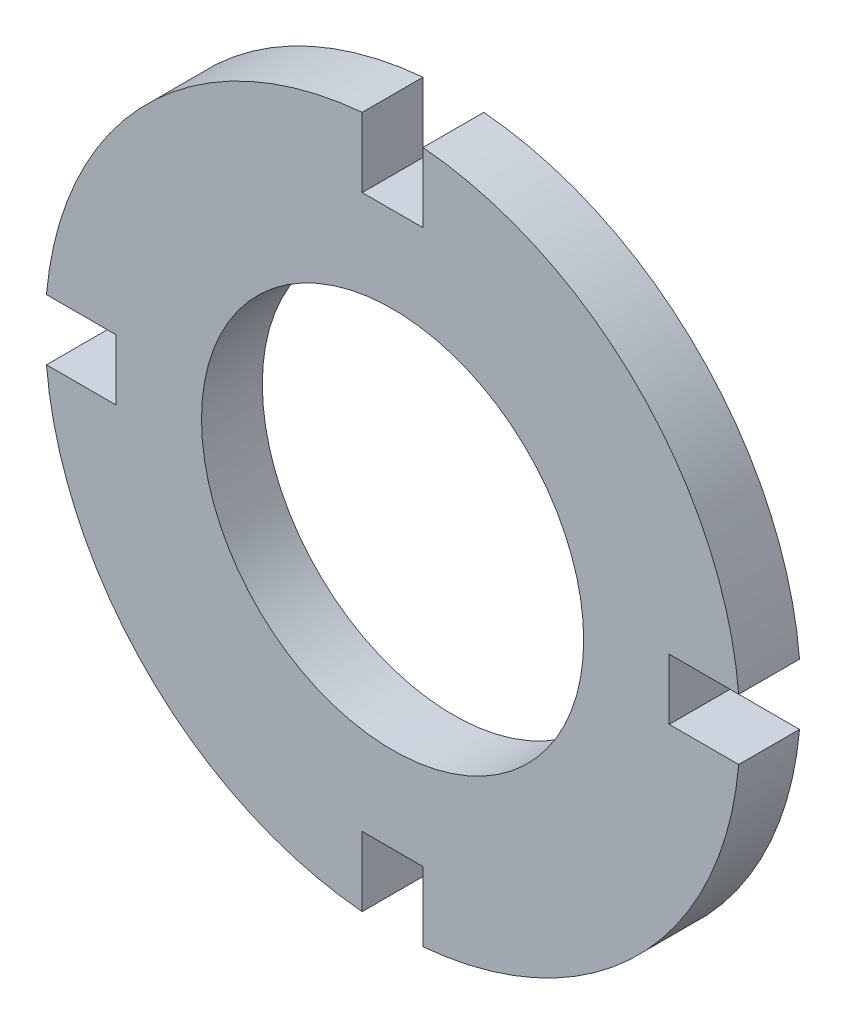
ISO-10303-21;
HEADER;
FILE_DESCRIPTION(('STEP AP214'),'2;1');
FILE_NAME('part.step','',(''),(''),'','','');
FILE_SCHEMA(('AUTOMOTIVE_DESIGN { 1 0 10303 214 1 1 1 1 }'));
ENDSEC;
DATA;
#1=APPLICATION_CONTEXT('core data for automotive mechanical design processes');
#2=APPLICATION_PROTOCOL_DEFINITION('international standard','automotive_design',2000,#1);
#3=PRODUCT_CONTEXT('',#1,'mechanical');
#4=PRODUCT('Part','Part','',(#3));
#5=PRODUCT_RELATED_PRODUCT_CATEGORY('part','',(#4));
#6=PRODUCT_DEFINITION_FORMATION('','',#4);
#7=PRODUCT_DEFINITION_CONTEXT('part definition',#1,'design');
#8=PRODUCT_DEFINITION('design','',#6,#7);
#9=PRODUCT_DEFINITION_SHAPE('','',#8);
#10=(LENGTH_UNIT() NAMED_UNIT(*) SI_UNIT(.MILLI.,.METRE.));
#11=(NAMED_UNIT(*) PLANE_ANGLE_UNIT() SI_UNIT($,.RADIAN.));
#12=(NAMED_UNIT(*) SI_UNIT($,.STERADIAN.) SOLID_ANGLE_UNIT());
#13=UNCERTAINTY_MEASURE_WITH_UNIT(LENGTH_MEASURE(1.E-05),#10,'distance_accuracy_value','');
#14=(GEOMETRIC_REPRESENTATION_CONTEXT(3) GLOBAL_UNCERTAINTY_ASSIGNED_CONTEXT((#13)) GLOBAL_UNIT_ASSIGNED_CONTEXT((#10,
#11,#12)) REPRESENTATION_CONTEXT('',''));
#15=CARTESIAN_POINT('',(0.,0.,0.));
#16=DIRECTION('',(0.,0.,1.));
#17=DIRECTION('',(1.,0.,0.));
#18=AXIS2_PLACEMENT_3D('',#15,#16,#17);
#19=CARTESIAN_POINT('',(0.,0.,4.445));
#20=DIRECTION('',(0.,0.,1.));
#21=DIRECTION('',(1.,0.,0.));
#22=AXIS2_PLACEMENT_3D('',#19,#20,#21);
#23=PLANE('',#22);
#24=CARTESIAN_POINT('',(0.,0.,4.445));
#25=DIRECTION('',(0.,0.,1.));
#26=DIRECTION('',(1.,0.,0.));
#27=AXIS2_PLACEMENT_3D('',#24,#25,#26);
#28=CIRCLE('',#27,25.4);
#29=CARTESIAN_POINT('',(2.2225,-25.3025787964389,4.445));
#30=VERTEX_POINT('',#29);
#31=CARTESIAN_POINT('',(25.3025787964389,-2.2225,4.445));
#32=VERTEX_POINT('',#31);
#33=EDGE_CURVE('E209',#30,#32,#28,.T.);
#34=ORIENTED_EDGE('',*,*,#33,.T.);
#35=DIRECTION('',(-1.,0.,0.));
#36=VECTOR('',#35,1.);
#37=CARTESIAN_POINT('',(25.3025787964389,-2.2225,4.445));
#38=LINE('',#37,#36);
#39=CARTESIAN_POINT('',(20.2225787964389,-2.2225,4.445));
#40=VERTEX_POINT('',#39);
#41=EDGE_CURVE('E117',#32,#40,#38,.T.);
#42=ORIENTED_EDGE('',*,*,#41,.T.);
#43=DIRECTION('',(0.,1.,0.));
#44=VECTOR('',#43,1.);
#45=CARTESIAN_POINT('',(20.2225787964389,-2.2225,4.445));
#46=LINE('',#45,#44);
#47=CARTESIAN_POINT('',(20.2225787964389,2.2225,4.445));
#48=VERTEX_POINT('',#47);
#49=EDGE_CURVE('E248',#40,#48,#46,.T.);
#50=ORIENTED_EDGE('',*,*,#49,.T.);
#51=DIRECTION('',(1.,0.,0.));
#52=VECTOR('',#51,1.);
#53=CARTESIAN_POINT('',(25.3025787964389,2.2225,4.445));
#54=LINE('',#53,#52);
#55=CARTESIAN_POINT('',(25.3025787964389,2.2225,4.445));
#56=VERTEX_POINT('',#55);
#57=EDGE_CURVE('E267',#48,#56,#54,.T.);
#58=ORIENTED_EDGE('',*,*,#57,.T.);
#59=CARTESIAN_POINT('',(0.,0.,4.445));
#60=DIRECTION('',(0.,0.,1.));
#61=DIRECTION('',(1.,0.,0.));
#62=AXIS2_PLACEMENT_3D('',#59,#60,#61);
#63=CIRCLE('',#62,25.4);
#64=CARTESIAN_POINT('',(2.2225,25.3025787964389,4.445));
#65=VERTEX_POINT('',#64);
#66=EDGE_CURVE('E264',#56,#65,#63,.T.);
#67=ORIENTED_EDGE('',*,*,#66,.T.);
#68=DIRECTION('',(0.,-1.,0.));
#69=VECTOR('',#68,1.);
#70=CARTESIAN_POINT('',(2.2225,25.3025787964389,4.445));
#71=LINE('',#70,#69);
#72=CARTESIAN_POINT('',(2.2225,20.2225787964389,4.445));
#73=VERTEX_POINT('',#72);
#74=EDGE_CURVE('E266',#65,#73,#71,.T.);
#75=ORIENTED_EDGE('',*,*,#74,.T.);
#76=DIRECTION('',(-1.,0.,0.));
#77=VECTOR('',#76,1.);
#78=CARTESIAN_POINT('',(-2.2225,20.2225787964389,4.445));
#79=LINE('',#78,#77);
#80=CARTESIAN_POINT('',(-2.2225,20.2225787964389,4.445));
#81=VERTEX_POINT('',#80);
#82=EDGE_CURVE('E269',#73,#81,#79,.T.);
#83=ORIENTED_EDGE('',*,*,#82,.T.);
#84=DIRECTION('',(0.,1.,0.));
#85=VECTOR('',#84,1.);
#86=CARTESIAN_POINT('',(-2.2225,25.3025787964389,4.445));
#87=LINE('',#86,#85);
#88=CARTESIAN_POINT('',(-2.2225,25.3025787964389,4.445));
#89=VERTEX_POINT('',#88);
#90=EDGE_CURVE('E275',#81,#89,#87,.T.);
#91=ORIENTED_EDGE('',*,*,#90,.T.);
#92=CARTESIAN_POINT('',(0.,0.,4.445));
#93=DIRECTION('',(0.,0.,1.));
#94=DIRECTION('',(1.,0.,0.));
#95=AXIS2_PLACEMENT_3D('',#92,#93,#94);
#96=CIRCLE('',#95,25.4);
#97=CARTESIAN_POINT('',(-25.3025787964389,2.2225,4.445));
#98=VERTEX_POINT('',#97);
#99=EDGE_CURVE('E277',#89,#98,#96,.T.);
#100=ORIENTED_EDGE('',*,*,#99,.T.);
#101=DIRECTION('',(1.,0.,0.));
#102=VECTOR('',#101,1.);
#103=CARTESIAN_POINT('',(-25.3025787964389,2.2225,4.445));
#104=LINE('',#103,#102);
#105=CARTESIAN_POINT('',(-20.2225787964389,2.22249999999999,4.445));
#106=VERTEX_POINT('',#105);
#107=EDGE_CURVE('E279',#98,#106,#104,.T.);
#108=ORIENTED_EDGE('',*,*,#107,.T.);
#109=DIRECTION('',(0.,-1.,0.));
#110=VECTOR('',#109,1.);
#111=CARTESIAN_POINT('',(-20.2225787964389,2.22249999999999,4.445));
#112=LINE('',#111,#110);
#113=CARTESIAN_POINT('',(-20.2225787964389,-2.2225,4.445));
#114=VERTEX_POINT('',#113);
#115=EDGE_CURVE('E281',#106,#114,#112,.T.);
#116=ORIENTED_EDGE('',*,*,#115,.T.);
#117=DIRECTION('',(-1.,0.,0.));
#118=VECTOR('',#117,1.);
#119=CARTESIAN_POINT('',(-25.3025787964389,-2.2225,4.445));
#120=LINE('',#119,#118);
#121=CARTESIAN_POINT('',(-25.3025787964389,-2.22249999999999,4.445));
#122=VERTEX_POINT('',#121);
#123=EDGE_CURVE('E283',#114,#122,#120,.T.);
#124=ORIENTED_EDGE('',*,*,#123,.T.);
#125=CARTESIAN_POINT('',(0.,0.,4.445));
#126=DIRECTION('',(0.,0.,1.));
#127=DIRECTION('',(1.,0.,0.));
#128=AXIS2_PLACEMENT_3D('',#125,#126,#127);
#129=CIRCLE('',#128,25.4);
#130=CARTESIAN_POINT('',(-2.2225,-25.3025787964389,4.445));
#131=VERTEX_POINT('',#130);
#132=EDGE_CURVE('E160',#122,#131,#129,.T.);
#133=ORIENTED_EDGE('',*,*,#132,.T.);
#134=DIRECTION('',(0.,1.,0.));
#135=VECTOR('',#134,1.);
#136=CARTESIAN_POINT('',(-2.2225,-25.3025787964389,4.445));
#137=LINE('',#136,#135);
#138=CARTESIAN_POINT('',(-2.2225,-20.2225787964389,4.445));
#139=VERTEX_POINT('',#138);
#140=EDGE_CURVE('E154',#131,#139,#137,.T.);
#141=ORIENTED_EDGE('',*,*,#140,.T.);
#142=DIRECTION('',(1.,0.,0.));
#143=VECTOR('',#142,1.);
#144=CARTESIAN_POINT('',(-2.2225,-20.2225787964389,4.445));
#145=LINE('',#144,#143);
#146=CARTESIAN_POINT('',(2.2225,-20.2225787964389,4.445));
#147=VERTEX_POINT('',#146);
#148=EDGE_CURVE('E158',#139,#147,#145,.T.);
#149=ORIENTED_EDGE('',*,*,#148,.T.);
#150=DIRECTION('',(0.,-1.,0.));
#151=VECTOR('',#150,1.);
#152=CARTESIAN_POINT('',(2.2225,-25.3025787964389,4.445));
#153=LINE('',#152,#151);
#154=EDGE_CURVE('E50',#147,#30,#153,.T.);
#155=ORIENTED_EDGE('',*,*,#154,.T.);
#156=EDGE_LOOP('',(#34,#42,#50,#58,#67,#75,#83,#91,#100,#108,#116,#124,#133,#141,#149,#155));
#157=FACE_BOUND('',#156,.T.);
#158=CARTESIAN_POINT('',(0.,0.,4.445));
#159=DIRECTION('',(0.,0.,1.));
#160=DIRECTION('',(1.,0.,0.));
#161=AXIS2_PLACEMENT_3D('',#158,#159,#160);
#162=CIRCLE('',#161,13.97);
#163=CARTESIAN_POINT('',(13.97,0.,4.445));
#164=VERTEX_POINT('',#163);
#165=EDGE_CURVE('E182',#164,#164,#162,.T.);
#166=ORIENTED_EDGE('',*,*,#165,.F.);
#167=EDGE_LOOP('',(#166));
#168=FACE_BOUND('',#167,.T.);
#169=ADVANCED_FACE('F33',(#157,#168),#23,.T.);
#170=CARTESIAN_POINT('',(0.,0.,0.));
#171=DIRECTION('',(0.,0.,1.));
#172=DIRECTION('',(1.,0.,0.));
#173=AXIS2_PLACEMENT_3D('',#170,#171,#172);
#174=PLANE('',#173);
#175=CARTESIAN_POINT('',(0.,0.,0.));
#176=DIRECTION('',(0.,0.,1.));
#177=DIRECTION('',(1.,0.,0.));
#178=AXIS2_PLACEMENT_3D('',#175,#176,#177);
#179=CIRCLE('',#178,25.4);
#180=CARTESIAN_POINT('',(2.2225,-25.3025787964389,0.));
#181=VERTEX_POINT('',#180);
#182=CARTESIAN_POINT('',(25.3025787964389,-2.2225,0.));
#183=VERTEX_POINT('',#182);
#184=EDGE_CURVE('E178',#181,#183,#179,.T.);
#185=ORIENTED_EDGE('',*,*,#184,.F.);
#186=DIRECTION('',(0.,-1.,0.));
#187=VECTOR('',#186,1.);
#188=CARTESIAN_POINT('',(2.2225,-25.3025787964389,0.));
#189=LINE('',#188,#187);
#190=CARTESIAN_POINT('',(2.2225,-20.2225787964389,0.));
#191=VERTEX_POINT('',#190);
#192=EDGE_CURVE('E109',#191,#181,#189,.T.);
#193=ORIENTED_EDGE('',*,*,#192,.F.);
#194=DIRECTION('',(1.,0.,0.));
#195=VECTOR('',#194,1.);
#196=CARTESIAN_POINT('',(-2.2225,-20.2225787964389,0.));
#197=LINE('',#196,#195);
#198=CARTESIAN_POINT('',(-2.2225,-20.2225787964389,0.));
#199=VERTEX_POINT('',#198);
#200=EDGE_CURVE('E103',#199,#191,#197,.T.);
#201=ORIENTED_EDGE('',*,*,#200,.F.);
#202=DIRECTION('',(0.,1.,0.));
#203=VECTOR('',#202,1.);
#204=CARTESIAN_POINT('',(-2.2225,-25.3025787964389,0.));
#205=LINE('',#204,#203);
#206=CARTESIAN_POINT('',(-2.2225,-25.3025787964389,0.));
#207=VERTEX_POINT('',#206);
#208=EDGE_CURVE('E168',#207,#199,#205,.T.);
#209=ORIENTED_EDGE('',*,*,#208,.F.);
#210=CARTESIAN_POINT('',(0.,0.,0.));
#211=DIRECTION('',(0.,0.,1.));
#212=DIRECTION('',(1.,0.,0.));
#213=AXIS2_PLACEMENT_3D('',#210,#211,#212);
#214=CIRCLE('',#213,25.4);
#215=CARTESIAN_POINT('',(-25.3025787964389,-2.22249999999999,0.));
#216=VERTEX_POINT('',#215);
#217=EDGE_CURVE('E204',#216,#207,#214,.T.);
#218=ORIENTED_EDGE('',*,*,#217,.F.);
#219=DIRECTION('',(-1.,0.,0.));
#220=VECTOR('',#219,1.);
#221=CARTESIAN_POINT('',(-25.3025787964389,-2.2225,0.));
#222=LINE('',#221,#220);
#223=CARTESIAN_POINT('',(-20.2225787964389,-2.2225,0.));
#224=VERTEX_POINT('',#223);
#225=EDGE_CURVE('E202',#224,#216,#222,.T.);
#226=ORIENTED_EDGE('',*,*,#225,.F.);
#227=DIRECTION('',(0.,-1.,0.));
#228=VECTOR('',#227,1.);
#229=CARTESIAN_POINT('',(-20.2225787964389,2.22249999999999,0.));
#230=LINE('',#229,#228);
#231=CARTESIAN_POINT('',(-20.2225787964389,2.22249999999999,0.));
#232=VERTEX_POINT('',#231);
#233=EDGE_CURVE('E200',#232,#224,#230,.T.);
#234=ORIENTED_EDGE('',*,*,#233,.F.);
#235=DIRECTION('',(1.,0.,0.));
#236=VECTOR('',#235,1.);
#237=CARTESIAN_POINT('',(-25.3025787964389,2.2225,0.));
#238=LINE('',#237,#236);
#239=CARTESIAN_POINT('',(-25.3025787964389,2.2225,0.));
#240=VERTEX_POINT('',#239);
#241=EDGE_CURVE('E198',#240,#232,#238,.T.);
#242=ORIENTED_EDGE('',*,*,#241,.F.);
#243=CARTESIAN_POINT('',(0.,0.,0.));
#244=DIRECTION('',(0.,0.,1.));
#245=DIRECTION('',(1.,0.,0.));
#246=AXIS2_PLACEMENT_3D('',#243,#244,#245);
#247=CIRCLE('',#246,25.4);
#248=CARTESIAN_POINT('',(-2.2225,25.3025787964389,0.));
#249=VERTEX_POINT('',#248);
#250=EDGE_CURVE('E196',#249,#240,#247,.T.);
#251=ORIENTED_EDGE('',*,*,#250,.F.);
#252=DIRECTION('',(0.,1.,0.));
#253=VECTOR('',#252,1.);
#254=CARTESIAN_POINT('',(-2.2225,25.3025787964389,0.));
#255=LINE('',#254,#253);
#256=CARTESIAN_POINT('',(-2.2225,20.2225787964389,0.));
#257=VERTEX_POINT('',#256);
#258=EDGE_CURVE('E194',#257,#249,#255,.T.);
#259=ORIENTED_EDGE('',*,*,#258,.F.);
#260=DIRECTION('',(-1.,0.,0.));
#261=VECTOR('',#260,1.);
#262=CARTESIAN_POINT('',(-2.2225,20.2225787964389,0.));
#263=LINE('',#262,#261);
#264=CARTESIAN_POINT('',(2.2225,20.2225787964389,0.));
#265=VERTEX_POINT('',#264);
#266=EDGE_CURVE('E192',#265,#257,#263,.T.);
#267=ORIENTED_EDGE('',*,*,#266,.F.);
#268=DIRECTION('',(0.,-1.,0.));
#269=VECTOR('',#268,1.);
#270=CARTESIAN_POINT('',(2.2225,25.3025787964389,0.));
#271=LINE('',#270,#269);
#272=CARTESIAN_POINT('',(2.2225,25.3025787964389,0.));
#273=VERTEX_POINT('',#272);
#274=EDGE_CURVE('E190',#273,#265,#271,.T.);
#275=ORIENTED_EDGE('',*,*,#274,.F.);
#276=CARTESIAN_POINT('',(0.,0.,0.));
#277=DIRECTION('',(0.,0.,1.));
#278=DIRECTION('',(1.,0.,0.));
#279=AXIS2_PLACEMENT_3D('',#276,#277,#278);
#280=CIRCLE('',#279,25.4);
#281=CARTESIAN_POINT('',(25.3025787964389,2.2225,0.));
#282=VERTEX_POINT('',#281);
#283=EDGE_CURVE('E188',#282,#273,#280,.T.);
#284=ORIENTED_EDGE('',*,*,#283,.F.);
#285=DIRECTION('',(1.,0.,0.));
#286=VECTOR('',#285,1.);
#287=CARTESIAN_POINT('',(25.3025787964389,2.2225,0.));
#288=LINE('',#287,#286);
#289=CARTESIAN_POINT('',(20.2225787964389,2.2225,0.));
#290=VERTEX_POINT('',#289);
#291=EDGE_CURVE('E186',#290,#282,#288,.T.);
#292=ORIENTED_EDGE('',*,*,#291,.F.);
#293=DIRECTION('',(0.,1.,0.));
#294=VECTOR('',#293,1.);
#295=CARTESIAN_POINT('',(20.2225787964389,-2.2225,0.));
#296=LINE('',#295,#294);
#297=CARTESIAN_POINT('',(20.2225787964389,-2.2225,0.));
#298=VERTEX_POINT('',#297);
#299=EDGE_CURVE('E184',#298,#290,#296,.T.);
#300=ORIENTED_EDGE('',*,*,#299,.F.);
#301=DIRECTION('',(-1.,0.,0.));
#302=VECTOR('',#301,1.);
#303=CARTESIAN_POINT('',(25.3025787964389,-2.2225,0.));
#304=LINE('',#303,#302);
#305=EDGE_CURVE('E181',#183,#298,#304,.T.);
#306=ORIENTED_EDGE('',*,*,#305,.F.);
#307=EDGE_LOOP('',(#185,#193,#201,#209,#218,#226,#234,#242,#251,#259,#267,#275,#284,#292,#300,#306));
#308=FACE_BOUND('',#307,.T.);
#309=CARTESIAN_POINT('',(0.,0.,0.));
#310=DIRECTION('',(0.,0.,1.));
#311=DIRECTION('',(1.,0.,0.));
#312=AXIS2_PLACEMENT_3D('',#309,#310,#311);
#313=CIRCLE('',#312,13.97);
#314=CARTESIAN_POINT('',(13.97,0.,0.));
#315=VERTEX_POINT('',#314);
#316=EDGE_CURVE('E482',#315,#315,#313,.T.);
#317=ORIENTED_EDGE('',*,*,#316,.T.);
#318=EDGE_LOOP('',(#317));
#319=FACE_BOUND('',#318,.T.);
#320=ADVANCED_FACE('F252',(#308,#319),#174,.F.);
#321=CARTESIAN_POINT('',(0.,0.,4.445));
#322=DIRECTION('',(0.,0.,-1.));
#323=DIRECTION('',(-1.,0.,0.));
#324=AXIS2_PLACEMENT_3D('',#321,#322,#323);
#325=CYLINDRICAL_SURFACE('',#324,25.4);
#326=ORIENTED_EDGE('',*,*,#184,.T.);
#327=DIRECTION('',(0.,0.,-1.));
#328=VECTOR('',#327,1.);
#329=CARTESIAN_POINT('',(25.3025787964389,-2.2225,4.445));
#330=LINE('',#329,#328);
#331=EDGE_CURVE('E11',#32,#183,#330,.T.);
#332=ORIENTED_EDGE('',*,*,#331,.F.);
#333=ORIENTED_EDGE('',*,*,#33,.F.);
#334=DIRECTION('',(0.,0.,-1.));
#335=VECTOR('',#334,1.);
#336=CARTESIAN_POINT('',(2.2225,-25.3025787964389,4.445));
#337=LINE('',#336,#335);
#338=EDGE_CURVE('E174',#30,#181,#337,.T.);
#339=ORIENTED_EDGE('',*,*,#338,.T.);
#340=EDGE_LOOP('',(#326,#332,#333,#339));
#341=FACE_BOUND('',#340,.T.);
#342=ADVANCED_FACE('F35',(#341),#325,.T.);
#343=CARTESIAN_POINT('',(25.3025787964389,-2.2225,4.445));
#344=DIRECTION('',(0.,-1.,0.));
#345=DIRECTION('',(1.,0.,0.));
#346=AXIS2_PLACEMENT_3D('',#343,#344,#345);
#347=PLANE('',#346);
#348=ORIENTED_EDGE('',*,*,#305,.T.);
#349=DIRECTION('',(0.,0.,-1.));
#350=VECTOR('',#349,1.);
#351=CARTESIAN_POINT('',(20.2225787964389,-2.2225,4.445));
#352=LINE('',#351,#350);
#353=EDGE_CURVE('E42',#40,#298,#352,.T.);
#354=ORIENTED_EDGE('',*,*,#353,.F.);
#355=ORIENTED_EDGE('',*,*,#41,.F.);
#356=ORIENTED_EDGE('',*,*,#331,.T.);
#357=EDGE_LOOP('',(#348,#354,#355,#356));
#358=FACE_BOUND('',#357,.T.);
#359=ADVANCED_FACE('F317',(#358),#347,.F.);
#360=CARTESIAN_POINT('',(20.2225787964389,-2.2225,4.445));
#361=DIRECTION('',(-1.,0.,0.));
#362=DIRECTION('',(0.,0.,1.));
#363=AXIS2_PLACEMENT_3D('',#360,#361,#362);
#364=PLANE('',#363);
#365=ORIENTED_EDGE('',*,*,#299,.T.);
#366=DIRECTION('',(0.,0.,-1.));
#367=VECTOR('',#366,1.);
#368=CARTESIAN_POINT('',(20.2225787964389,2.2225,4.445));
#369=LINE('',#368,#367);
#370=EDGE_CURVE('E240',#48,#290,#369,.T.);
#371=ORIENTED_EDGE('',*,*,#370,.F.);
#372=ORIENTED_EDGE('',*,*,#49,.F.);
#373=ORIENTED_EDGE('',*,*,#353,.T.);
#374=EDGE_LOOP('',(#365,#371,#372,#373));
#375=FACE_BOUND('',#374,.T.);
#376=ADVANCED_FACE('F246',(#375),#364,.F.);
#377=CARTESIAN_POINT('',(25.3025787964389,2.2225,4.445));
#378=DIRECTION('',(0.,1.,0.));
#379=DIRECTION('',(-1.,0.,0.));
#380=AXIS2_PLACEMENT_3D('',#377,#378,#379);
#381=PLANE('',#380);
#382=ORIENTED_EDGE('',*,*,#291,.T.);
#383=DIRECTION('',(0.,0.,-1.));
#384=VECTOR('',#383,1.);
#385=CARTESIAN_POINT('',(25.3025787964389,2.2225,4.445));
#386=LINE('',#385,#384);
#387=EDGE_CURVE('E237',#56,#282,#386,.T.);
#388=ORIENTED_EDGE('',*,*,#387,.F.);
#389=ORIENTED_EDGE('',*,*,#57,.F.);
#390=ORIENTED_EDGE('',*,*,#370,.T.);
#391=EDGE_LOOP('',(#382,#388,#389,#390));
#392=FACE_BOUND('',#391,.T.);
#393=ADVANCED_FACE('F258',(#392),#381,.F.);
#394=CARTESIAN_POINT('',(0.,0.,4.445));
#395=DIRECTION('',(0.,0.,-1.));
#396=DIRECTION('',(-1.,0.,0.));
#397=AXIS2_PLACEMENT_3D('',#394,#395,#396);
#398=CYLINDRICAL_SURFACE('',#397,25.4);
#399=ORIENTED_EDGE('',*,*,#283,.T.);
#400=DIRECTION('',(0.,0.,-1.));
#401=VECTOR('',#400,1.);
#402=CARTESIAN_POINT('',(2.2225,25.3025787964389,4.445));
#403=LINE('',#402,#401);
#404=EDGE_CURVE('E234',#65,#273,#403,.T.);
#405=ORIENTED_EDGE('',*,*,#404,.F.);
#406=ORIENTED_EDGE('',*,*,#66,.F.);
#407=ORIENTED_EDGE('',*,*,#387,.T.);
#408=EDGE_LOOP('',(#399,#405,#406,#407));
#409=FACE_BOUND('',#408,.T.);
#410=ADVANCED_FACE('F262',(#409),#398,.T.);
#411=CARTESIAN_POINT('',(2.2225,25.3025787964389,4.445));
#412=DIRECTION('',(1.,0.,0.));
#413=DIRECTION('',(0.,1.,0.));
#414=AXIS2_PLACEMENT_3D('',#411,#412,#413);
#415=PLANE('',#414);
#416=ORIENTED_EDGE('',*,*,#274,.T.);
#417=DIRECTION('',(0.,0.,-1.));
#418=VECTOR('',#417,1.);
#419=CARTESIAN_POINT('',(2.2225,20.2225787964389,4.445));
#420=LINE('',#419,#418);
#421=EDGE_CURVE('E231',#73,#265,#420,.T.);
#422=ORIENTED_EDGE('',*,*,#421,.F.);
#423=ORIENTED_EDGE('',*,*,#74,.F.);
#424=ORIENTED_EDGE('',*,*,#404,.T.);
#425=EDGE_LOOP('',(#416,#422,#423,#424));
#426=FACE_BOUND('',#425,.T.);
#427=ADVANCED_FACE('F330',(#426),#415,.F.);
#428=CARTESIAN_POINT('',(-2.2225,20.2225787964389,4.445));
#429=DIRECTION('',(0.,-1.,0.));
#430=DIRECTION('',(1.,0.,0.));
#431=AXIS2_PLACEMENT_3D('',#428,#429,#430);
#432=PLANE('',#431);
#433=ORIENTED_EDGE('',*,*,#266,.T.);
#434=DIRECTION('',(0.,0.,-1.));
#435=VECTOR('',#434,1.);
#436=CARTESIAN_POINT('',(-2.2225,20.2225787964389,4.445));
#437=LINE('',#436,#435);
#438=EDGE_CURVE('E228',#81,#257,#437,.T.);
#439=ORIENTED_EDGE('',*,*,#438,.F.);
#440=ORIENTED_EDGE('',*,*,#82,.F.);
#441=ORIENTED_EDGE('',*,*,#421,.T.);
#442=EDGE_LOOP('',(#433,#439,#440,#441));
#443=FACE_BOUND('',#442,.T.);
#444=ADVANCED_FACE('F333',(#443),#432,.F.);
#445=CARTESIAN_POINT('',(-2.2225,25.3025787964389,4.445));
#446=DIRECTION('',(-1.,0.,0.));
#447=DIRECTION('',(0.,-1.,0.));
#448=AXIS2_PLACEMENT_3D('',#445,#446,#447);
#449=PLANE('',#448);
#450=ORIENTED_EDGE('',*,*,#258,.T.);
#451=DIRECTION('',(0.,0.,-1.));
#452=VECTOR('',#451,1.);
#453=CARTESIAN_POINT('',(-2.2225,25.3025787964389,4.445));
#454=LINE('',#453,#452);
#455=EDGE_CURVE('E225',#89,#249,#454,.T.);
#456=ORIENTED_EDGE('',*,*,#455,.F.);
#457=ORIENTED_EDGE('',*,*,#90,.F.);
#458=ORIENTED_EDGE('',*,*,#438,.T.);
#459=EDGE_LOOP('',(#450,#456,#457,#458));
#460=FACE_BOUND('',#459,.T.);
#461=ADVANCED_FACE('F337',(#460),#449,.F.);
#462=CARTESIAN_POINT('',(0.,0.,4.445));
#463=DIRECTION('',(0.,0.,-1.));
#464=DIRECTION('',(-1.,0.,0.));
#465=AXIS2_PLACEMENT_3D('',#462,#463,#464);
#466=CYLINDRICAL_SURFACE('',#465,25.4);
#467=ORIENTED_EDGE('',*,*,#250,.T.);
#468=DIRECTION('',(0.,0.,-1.));
#469=VECTOR('',#468,1.);
#470=CARTESIAN_POINT('',(-25.3025787964389,2.2225,4.445));
#471=LINE('',#470,#469);
#472=EDGE_CURVE('E222',#98,#240,#471,.T.);
#473=ORIENTED_EDGE('',*,*,#472,.F.);
#474=ORIENTED_EDGE('',*,*,#99,.F.);
#475=ORIENTED_EDGE('',*,*,#455,.T.);
#476=EDGE_LOOP('',(#467,#473,#474,#475));
#477=FACE_BOUND('',#476,.T.);
#478=ADVANCED_FACE('F341',(#477),#466,.T.);
#479=CARTESIAN_POINT('',(-25.3025787964389,2.2225,4.445));
#480=DIRECTION('',(0.,1.,0.));
#481=DIRECTION('',(-1.,0.,0.));
#482=AXIS2_PLACEMENT_3D('',#479,#480,#481);
#483=PLANE('',#482);
#484=ORIENTED_EDGE('',*,*,#241,.T.);
#485=DIRECTION('',(0.,0.,-1.));
#486=VECTOR('',#485,1.);
#487=CARTESIAN_POINT('',(-20.2225787964389,2.22249999999999,4.445));
#488=LINE('',#487,#486);
#489=EDGE_CURVE('E219',#106,#232,#488,.T.);
#490=ORIENTED_EDGE('',*,*,#489,.F.);
#491=ORIENTED_EDGE('',*,*,#107,.F.);
#492=ORIENTED_EDGE('',*,*,#472,.T.);
#493=EDGE_LOOP('',(#484,#490,#491,#492));
#494=FACE_BOUND('',#493,.T.);
#495=ADVANCED_FACE('F345',(#494),#483,.F.);
#496=CARTESIAN_POINT('',(-20.2225787964389,2.22249999999999,4.445));
#497=DIRECTION('',(1.,0.,0.));
#498=DIRECTION('',(0.,0.,-1.));
#499=AXIS2_PLACEMENT_3D('',#496,#497,#498);
#500=PLANE('',#499);
#501=ORIENTED_EDGE('',*,*,#233,.T.);
#502=DIRECTION('',(0.,0.,-1.));
#503=VECTOR('',#502,1.);
#504=CARTESIAN_POINT('',(-20.2225787964389,-2.2225,4.445));
#505=LINE('',#504,#503);
#506=EDGE_CURVE('E216',#114,#224,#505,.T.);
#507=ORIENTED_EDGE('',*,*,#506,.F.);
#508=ORIENTED_EDGE('',*,*,#115,.F.);
#509=ORIENTED_EDGE('',*,*,#489,.T.);
#510=EDGE_LOOP('',(#501,#507,#508,#509));
#511=FACE_BOUND('',#510,.T.);
#512=ADVANCED_FACE('F349',(#511),#500,.F.);
#513=CARTESIAN_POINT('',(-25.3025787964389,-2.2225,4.445));
#514=DIRECTION('',(0.,-1.,0.));
#515=DIRECTION('',(1.,0.,0.));
#516=AXIS2_PLACEMENT_3D('',#513,#514,#515);
#517=PLANE('',#516);
#518=ORIENTED_EDGE('',*,*,#225,.T.);
#519=DIRECTION('',(0.,0.,-1.));
#520=VECTOR('',#519,1.);
#521=CARTESIAN_POINT('',(-25.3025787964389,-2.22249999999999,4.445));
#522=LINE('',#521,#520);
#523=EDGE_CURVE('E213',#122,#216,#522,.T.);
#524=ORIENTED_EDGE('',*,*,#523,.F.);
#525=ORIENTED_EDGE('',*,*,#123,.F.);
#526=ORIENTED_EDGE('',*,*,#506,.T.);
#527=EDGE_LOOP('',(#518,#524,#525,#526));
#528=FACE_BOUND('',#527,.T.);
#529=ADVANCED_FACE('F289',(#528),#517,.F.);
#530=CARTESIAN_POINT('',(0.,0.,4.445));
#531=DIRECTION('',(0.,0.,-1.));
#532=DIRECTION('',(-1.,0.,0.));
#533=AXIS2_PLACEMENT_3D('',#530,#531,#532);
#534=CYLINDRICAL_SURFACE('',#533,25.4);
#535=ORIENTED_EDGE('',*,*,#217,.T.);
#536=DIRECTION('',(0.,0.,-1.));
#537=VECTOR('',#536,1.);
#538=CARTESIAN_POINT('',(-2.2225,-25.3025787964389,4.445));
#539=LINE('',#538,#537);
#540=EDGE_CURVE('E169',#131,#207,#539,.T.);
#541=ORIENTED_EDGE('',*,*,#540,.F.);
#542=ORIENTED_EDGE('',*,*,#132,.F.);
#543=ORIENTED_EDGE('',*,*,#523,.T.);
#544=EDGE_LOOP('',(#535,#541,#542,#543));
#545=FACE_BOUND('',#544,.T.);
#546=ADVANCED_FACE('F293',(#545),#534,.T.);
#547=CARTESIAN_POINT('',(-2.2225,-25.3025787964389,4.445));
#548=DIRECTION('',(-1.,0.,0.));
#549=DIRECTION('',(0.,0.,1.));
#550=AXIS2_PLACEMENT_3D('',#547,#548,#549);
#551=PLANE('',#550);
#552=ORIENTED_EDGE('',*,*,#208,.T.);
#553=DIRECTION('',(0.,0.,-1.));
#554=VECTOR('',#553,1.);
#555=CARTESIAN_POINT('',(-2.2225,-20.2225787964389,4.445));
#556=LINE('',#555,#554);
#557=EDGE_CURVE('E165',#139,#199,#556,.T.);
#558=ORIENTED_EDGE('',*,*,#557,.F.);
#559=ORIENTED_EDGE('',*,*,#140,.F.);
#560=ORIENTED_EDGE('',*,*,#540,.T.);
#561=EDGE_LOOP('',(#552,#558,#559,#560));
#562=FACE_BOUND('',#561,.T.);
#563=ADVANCED_FACE('F166',(#562),#551,.F.);
#564=CARTESIAN_POINT('',(-2.2225,-20.2225787964389,4.445));
#565=DIRECTION('',(0.,1.,0.));
#566=DIRECTION('',(0.,0.,1.));
#567=AXIS2_PLACEMENT_3D('',#564,#565,#566);
#568=PLANE('',#567);
#569=ORIENTED_EDGE('',*,*,#200,.T.);
#570=DIRECTION('',(0.,0.,-1.));
#571=VECTOR('',#570,1.);
#572=CARTESIAN_POINT('',(2.2225,-20.2225787964389,4.445));
#573=LINE('',#572,#571);
#574=EDGE_CURVE('E170',#147,#191,#573,.T.);
#575=ORIENTED_EDGE('',*,*,#574,.F.);
#576=ORIENTED_EDGE('',*,*,#148,.F.);
#577=ORIENTED_EDGE('',*,*,#557,.T.);
#578=EDGE_LOOP('',(#569,#575,#576,#577));
#579=FACE_BOUND('',#578,.T.);
#580=ADVANCED_FACE('F172',(#579),#568,.F.);
#581=CARTESIAN_POINT('',(2.2225,-25.3025787964389,4.445));
#582=DIRECTION('',(1.,0.,0.));
#583=DIRECTION('',(0.,0.,-1.));
#584=AXIS2_PLACEMENT_3D('',#581,#582,#583);
#585=PLANE('',#584);
#586=ORIENTED_EDGE('',*,*,#192,.T.);
#587=ORIENTED_EDGE('',*,*,#338,.F.);
#588=ORIENTED_EDGE('',*,*,#154,.F.);
#589=ORIENTED_EDGE('',*,*,#574,.T.);
#590=EDGE_LOOP('',(#586,#587,#588,#589));
#591=FACE_BOUND('',#590,.T.);
#592=ADVANCED_FACE('F297',(#591),#585,.F.);
#593=CARTESIAN_POINT('',(0.,0.,4.445));
#594=DIRECTION('',(0.,0.,-1.));
#595=DIRECTION('',(-1.,0.,0.));
#596=AXIS2_PLACEMENT_3D('',#593,#594,#595);
#597=CYLINDRICAL_SURFACE('',#596,13.97);
#598=ORIENTED_EDGE('',*,*,#165,.T.);
#599=EDGE_LOOP('',(#598));
#600=FACE_BOUND('',#599,.T.);
#601=ORIENTED_EDGE('',*,*,#316,.F.);
#602=EDGE_LOOP('',(#601));
#603=FACE_BOUND('',#602,.T.);
#604=ADVANCED_FACE('F299',(#600,#603),#597,.F.);
#605=CLOSED_SHELL('',(#169,#320,#342,#359,#376,#393,#410,#427,#444,#461,#478,#495,#512,#529,
#546,#563,#580,#592,#604));
#606=MANIFOLD_SOLID_BREP('B2',#605);
#607=ADVANCED_BREP_SHAPE_REPRESENTATION('',(#18,#606),#14);
#608=SHAPE_DEFINITION_REPRESENTATION(#9,#607);
ENDSEC;
END-ISO-10303-21;
